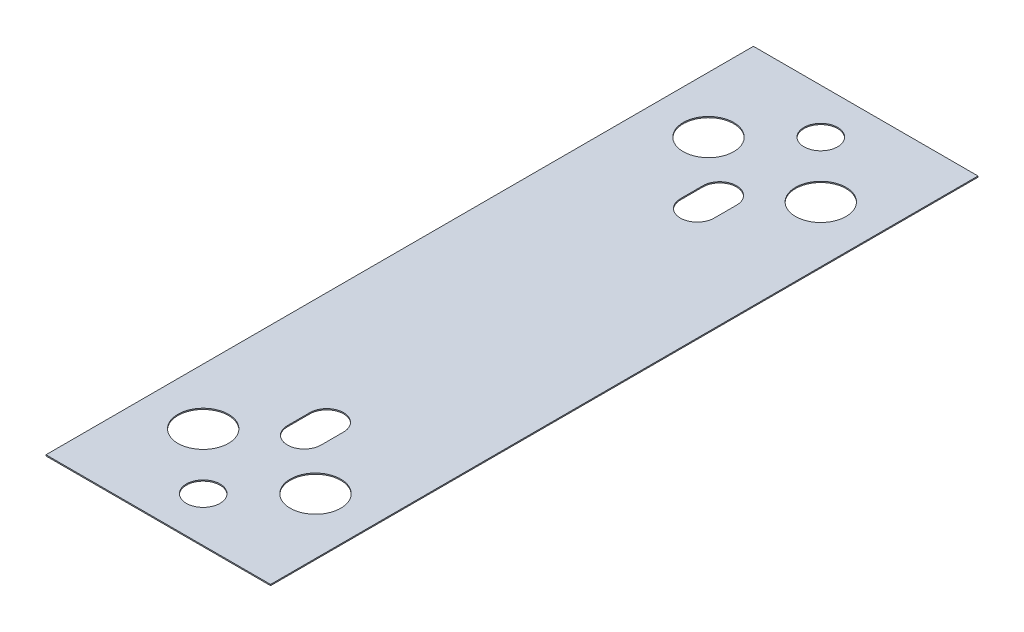
ISO-10303-21;
HEADER;
FILE_DESCRIPTION(('STEP AP214'),'2;1');
FILE_NAME('part.step','',(''),(''),'','','');
FILE_SCHEMA(('AUTOMOTIVE_DESIGN { 1 0 10303 214 1 1 1 1 }'));
ENDSEC;
DATA;
#1=APPLICATION_CONTEXT('core data for automotive mechanical design processes');
#2=APPLICATION_PROTOCOL_DEFINITION('international standard','automotive_design',2000,#1);
#3=PRODUCT_CONTEXT('',#1,'mechanical');
#4=PRODUCT('Part','Part','',(#3));
#5=PRODUCT_RELATED_PRODUCT_CATEGORY('part','',(#4));
#6=PRODUCT_DEFINITION_FORMATION('','',#4);
#7=PRODUCT_DEFINITION_CONTEXT('part definition',#1,'design');
#8=PRODUCT_DEFINITION('design','',#6,#7);
#9=PRODUCT_DEFINITION_SHAPE('','',#8);
#10=(LENGTH_UNIT() NAMED_UNIT(*) SI_UNIT(.MILLI.,.METRE.));
#11=(NAMED_UNIT(*) PLANE_ANGLE_UNIT() SI_UNIT($,.RADIAN.));
#12=(NAMED_UNIT(*) SI_UNIT($,.STERADIAN.) SOLID_ANGLE_UNIT());
#13=UNCERTAINTY_MEASURE_WITH_UNIT(LENGTH_MEASURE(1.E-05),#10,'distance_accuracy_value','');
#14=(GEOMETRIC_REPRESENTATION_CONTEXT(3) GLOBAL_UNCERTAINTY_ASSIGNED_CONTEXT((#13)) GLOBAL_UNIT_ASSIGNED_CONTEXT((#10,
#11,#12)) REPRESENTATION_CONTEXT('',''));
#15=CARTESIAN_POINT('',(0.,0.,0.));
#16=DIRECTION('',(0.,0.,1.));
#17=DIRECTION('',(1.,0.,0.));
#18=AXIS2_PLACEMENT_3D('',#15,#16,#17);
#19=CARTESIAN_POINT('',(0.,0.,31.5));
#20=DIRECTION('',(0.,1.,0.));
#21=DIRECTION('',(0.,0.,1.));
#22=AXIS2_PLACEMENT_3D('',#19,#20,#21);
#23=PLANE('',#22);
#24=DIRECTION('',(1.,0.,0.));
#25=VECTOR('',#24,1.);
#26=CARTESIAN_POINT('',(0.,0.,-31.5));
#27=LINE('',#26,#25);
#28=CARTESIAN_POINT('',(0.,0.,-31.5));
#29=VERTEX_POINT('',#28);
#30=CARTESIAN_POINT('',(20.,0.,-31.5));
#31=VERTEX_POINT('',#30);
#32=EDGE_CURVE('E223',#29,#31,#27,.T.);
#33=ORIENTED_EDGE('',*,*,#32,.T.);
#34=DIRECTION('',(0.,0.,-1.));
#35=VECTOR('',#34,1.);
#36=CARTESIAN_POINT('',(20.,0.,31.5));
#37=LINE('',#36,#35);
#38=CARTESIAN_POINT('',(20.,0.,31.5));
#39=VERTEX_POINT('',#38);
#40=EDGE_CURVE('E25',#39,#31,#37,.T.);
#41=ORIENTED_EDGE('',*,*,#40,.F.);
#42=DIRECTION('',(1.,0.,0.));
#43=VECTOR('',#42,1.);
#44=CARTESIAN_POINT('',(0.,0.,31.5));
#45=LINE('',#44,#43);
#46=CARTESIAN_POINT('',(0.,0.,31.5));
#47=VERTEX_POINT('',#46);
#48=EDGE_CURVE('E213',#47,#39,#45,.T.);
#49=ORIENTED_EDGE('',*,*,#48,.F.);
#50=DIRECTION('',(0.,0.,-1.));
#51=VECTOR('',#50,1.);
#52=CARTESIAN_POINT('',(0.,0.,31.5));
#53=LINE('',#52,#51);
#54=EDGE_CURVE('E11',#47,#29,#53,.T.);
#55=ORIENTED_EDGE('',*,*,#54,.T.);
#56=EDGE_LOOP('',(#33,#41,#49,#55));
#57=FACE_BOUND('',#56,.T.);
#58=CARTESIAN_POINT('',(15.,0.,22.5));
#59=DIRECTION('',(0.,1.,0.));
#60=DIRECTION('',(0.,0.,1.));
#61=AXIS2_PLACEMENT_3D('',#58,#59,#60);
#62=CIRCLE('',#61,2.25);
#63=CARTESIAN_POINT('',(15.,0.,24.75));
#64=VERTEX_POINT('',#63);
#65=EDGE_CURVE('E206',#64,#64,#62,.T.);
#66=ORIENTED_EDGE('',*,*,#65,.T.);
#67=EDGE_LOOP('',(#66));
#68=FACE_BOUND('',#67,.T.);
#69=CARTESIAN_POINT('',(5.,0.,22.5));
#70=DIRECTION('',(0.,1.,0.));
#71=DIRECTION('',(0.,0.,1.));
#72=AXIS2_PLACEMENT_3D('',#69,#70,#71);
#73=CIRCLE('',#72,2.25);
#74=CARTESIAN_POINT('',(5.,0.,24.75));
#75=VERTEX_POINT('',#74);
#76=EDGE_CURVE('E200',#75,#75,#73,.T.);
#77=ORIENTED_EDGE('',*,*,#76,.T.);
#78=EDGE_LOOP('',(#77));
#79=FACE_BOUND('',#78,.T.);
#80=CARTESIAN_POINT('',(10.,0.,27.5));
#81=DIRECTION('',(0.,-1.,0.));
#82=DIRECTION('',(0.,0.,-1.));
#83=AXIS2_PLACEMENT_3D('',#80,#81,#82);
#84=CIRCLE('',#83,1.5);
#85=CARTESIAN_POINT('',(10.,0.,26.));
#86=VERTEX_POINT('',#85);
#87=EDGE_CURVE('E191',#86,#86,#84,.T.);
#88=ORIENTED_EDGE('',*,*,#87,.F.);
#89=EDGE_LOOP('',(#88));
#90=FACE_BOUND('',#89,.T.);
#91=CARTESIAN_POINT('',(10.,0.,18.5));
#92=DIRECTION('',(0.,-1.,0.));
#93=DIRECTION('',(0.,0.,-1.));
#94=AXIS2_PLACEMENT_3D('',#91,#92,#93);
#95=CIRCLE('',#94,1.5);
#96=CARTESIAN_POINT('',(11.5,0.,18.5));
#97=VERTEX_POINT('',#96);
#98=CARTESIAN_POINT('',(8.5,0.,18.5));
#99=VERTEX_POINT('',#98);
#100=EDGE_CURVE('E168',#97,#99,#95,.T.);
#101=ORIENTED_EDGE('',*,*,#100,.F.);
#102=DIRECTION('',(0.,0.,-1.));
#103=VECTOR('',#102,1.);
#104=CARTESIAN_POINT('',(11.5,0.,18.5));
#105=LINE('',#104,#103);
#106=CARTESIAN_POINT('',(11.5,0.,16.5));
#107=VERTEX_POINT('',#106);
#108=EDGE_CURVE('E162',#97,#107,#105,.T.);
#109=ORIENTED_EDGE('',*,*,#108,.T.);
#110=CARTESIAN_POINT('',(10.,0.,16.5));
#111=DIRECTION('',(0.,-1.,0.));
#112=DIRECTION('',(0.,0.,-1.));
#113=AXIS2_PLACEMENT_3D('',#110,#111,#112);
#114=CIRCLE('',#113,1.5);
#115=CARTESIAN_POINT('',(8.5,0.,16.5));
#116=VERTEX_POINT('',#115);
#117=EDGE_CURVE('E176',#116,#107,#114,.T.);
#118=ORIENTED_EDGE('',*,*,#117,.F.);
#119=DIRECTION('',(0.,0.,-1.));
#120=VECTOR('',#119,1.);
#121=CARTESIAN_POINT('',(8.5,0.,18.5));
#122=LINE('',#121,#120);
#123=EDGE_CURVE('E160',#99,#116,#122,.T.);
#124=ORIENTED_EDGE('',*,*,#123,.F.);
#125=EDGE_LOOP('',(#101,#109,#118,#124));
#126=FACE_BOUND('',#125,.T.);
#127=CARTESIAN_POINT('',(15.,0.,-22.5));
#128=DIRECTION('',(0.,1.,0.));
#129=DIRECTION('',(0.,0.,1.));
#130=AXIS2_PLACEMENT_3D('',#127,#128,#129);
#131=CIRCLE('',#130,2.25);
#132=CARTESIAN_POINT('',(15.,0.,-20.25));
#133=VERTEX_POINT('',#132);
#134=EDGE_CURVE('E157',#133,#133,#131,.T.);
#135=ORIENTED_EDGE('',*,*,#134,.T.);
#136=EDGE_LOOP('',(#135));
#137=FACE_BOUND('',#136,.T.);
#138=CARTESIAN_POINT('',(5.,0.,-22.5));
#139=DIRECTION('',(0.,1.,0.));
#140=DIRECTION('',(0.,0.,1.));
#141=AXIS2_PLACEMENT_3D('',#138,#139,#140);
#142=CIRCLE('',#141,2.25);
#143=CARTESIAN_POINT('',(5.,0.,-20.25));
#144=VERTEX_POINT('',#143);
#145=EDGE_CURVE('E151',#144,#144,#142,.T.);
#146=ORIENTED_EDGE('',*,*,#145,.T.);
#147=EDGE_LOOP('',(#146));
#148=FACE_BOUND('',#147,.T.);
#149=CARTESIAN_POINT('',(10.,0.,-27.5));
#150=DIRECTION('',(0.,-1.,0.));
#151=DIRECTION('',(0.,0.,-1.));
#152=AXIS2_PLACEMENT_3D('',#149,#150,#151);
#153=CIRCLE('',#152,1.5);
#154=CARTESIAN_POINT('',(10.,0.,-29.));
#155=VERTEX_POINT('',#154);
#156=EDGE_CURVE('E142',#155,#155,#153,.T.);
#157=ORIENTED_EDGE('',*,*,#156,.F.);
#158=EDGE_LOOP('',(#157));
#159=FACE_BOUND('',#158,.T.);
#160=CARTESIAN_POINT('',(10.,0.,-16.5));
#161=DIRECTION('',(0.,-1.,0.));
#162=DIRECTION('',(0.,0.,-1.));
#163=AXIS2_PLACEMENT_3D('',#160,#161,#162);
#164=CIRCLE('',#163,1.5);
#165=CARTESIAN_POINT('',(11.5,0.,-16.5));
#166=VERTEX_POINT('',#165);
#167=CARTESIAN_POINT('',(8.5,0.,-16.5));
#168=VERTEX_POINT('',#167);
#169=EDGE_CURVE('E116',#166,#168,#164,.T.);
#170=ORIENTED_EDGE('',*,*,#169,.F.);
#171=DIRECTION('',(0.,0.,1.));
#172=VECTOR('',#171,1.);
#173=CARTESIAN_POINT('',(11.5,0.,-18.5));
#174=LINE('',#173,#172);
#175=CARTESIAN_POINT('',(11.5,0.,-18.5));
#176=VERTEX_POINT('',#175);
#177=EDGE_CURVE('E125',#176,#166,#174,.T.);
#178=ORIENTED_EDGE('',*,*,#177,.F.);
#179=CARTESIAN_POINT('',(10.,0.,-18.5));
#180=DIRECTION('',(0.,-1.,0.));
#181=DIRECTION('',(0.,0.,-1.));
#182=AXIS2_PLACEMENT_3D('',#179,#180,#181);
#183=CIRCLE('',#182,1.5);
#184=CARTESIAN_POINT('',(8.5,0.,-18.5));
#185=VERTEX_POINT('',#184);
#186=EDGE_CURVE('E123',#185,#176,#183,.T.);
#187=ORIENTED_EDGE('',*,*,#186,.F.);
#188=DIRECTION('',(0.,0.,1.));
#189=VECTOR('',#188,1.);
#190=CARTESIAN_POINT('',(8.5,0.,-18.5));
#191=LINE('',#190,#189);
#192=EDGE_CURVE('E109',#185,#168,#191,.T.);
#193=ORIENTED_EDGE('',*,*,#192,.T.);
#194=EDGE_LOOP('',(#170,#178,#187,#193));
#195=FACE_BOUND('',#194,.T.);
#196=ADVANCED_FACE('F17',(#57,#68,#79,#90,#126,#137,#148,#159,#195),#23,.F.);
#197=CARTESIAN_POINT('',(0.,0.1,31.5));
#198=DIRECTION('',(0.,-1.,0.));
#199=DIRECTION('',(0.,0.,-1.));
#200=AXIS2_PLACEMENT_3D('',#197,#198,#199);
#201=PLANE('',#200);
#202=CARTESIAN_POINT('',(10.,0.1,-16.5));
#203=DIRECTION('',(0.,-1.,0.));
#204=DIRECTION('',(0.,0.,-1.));
#205=AXIS2_PLACEMENT_3D('',#202,#203,#204);
#206=CIRCLE('',#205,1.49999999999999);
#207=CARTESIAN_POINT('',(11.5,0.1,-16.5));
#208=VERTEX_POINT('',#207);
#209=CARTESIAN_POINT('',(8.5,0.1,-16.5));
#210=VERTEX_POINT('',#209);
#211=EDGE_CURVE('E140',#208,#210,#206,.T.);
#212=ORIENTED_EDGE('',*,*,#211,.T.);
#213=DIRECTION('',(0.,0.,-1.));
#214=VECTOR('',#213,1.);
#215=CARTESIAN_POINT('',(8.5,0.1,31.5));
#216=LINE('',#215,#214);
#217=CARTESIAN_POINT('',(8.5,0.1,-18.5));
#218=VERTEX_POINT('',#217);
#219=EDGE_CURVE('E112',#210,#218,#216,.T.);
#220=ORIENTED_EDGE('',*,*,#219,.T.);
#221=CARTESIAN_POINT('',(10.,0.1,-18.5));
#222=DIRECTION('',(0.,-1.,0.));
#223=DIRECTION('',(0.,0.,-1.));
#224=AXIS2_PLACEMENT_3D('',#221,#222,#223);
#225=CIRCLE('',#224,1.49999999999999);
#226=CARTESIAN_POINT('',(11.5,0.1,-18.5));
#227=VERTEX_POINT('',#226);
#228=EDGE_CURVE('E137',#218,#227,#225,.T.);
#229=ORIENTED_EDGE('',*,*,#228,.T.);
#230=DIRECTION('',(0.,0.,1.));
#231=VECTOR('',#230,1.);
#232=CARTESIAN_POINT('',(11.5,0.1,31.5));
#233=LINE('',#232,#231);
#234=EDGE_CURVE('E115',#227,#208,#233,.T.);
#235=ORIENTED_EDGE('',*,*,#234,.T.);
#236=EDGE_LOOP('',(#212,#220,#229,#235));
#237=FACE_BOUND('',#236,.T.);
#238=CARTESIAN_POINT('',(10.,0.1,-27.5));
#239=DIRECTION('',(0.,-1.,0.));
#240=DIRECTION('',(0.,0.,-1.));
#241=AXIS2_PLACEMENT_3D('',#238,#239,#240);
#242=CIRCLE('',#241,1.5);
#243=CARTESIAN_POINT('',(10.,0.1,-29.));
#244=VERTEX_POINT('',#243);
#245=EDGE_CURVE('E145',#244,#244,#242,.T.);
#246=ORIENTED_EDGE('',*,*,#245,.T.);
#247=EDGE_LOOP('',(#246));
#248=FACE_BOUND('',#247,.T.);
#249=CARTESIAN_POINT('',(5.,0.100000000000001,-22.5));
#250=DIRECTION('',(0.,1.,0.));
#251=DIRECTION('',(0.,0.,1.));
#252=AXIS2_PLACEMENT_3D('',#249,#250,#251);
#253=CIRCLE('',#252,2.25);
#254=CARTESIAN_POINT('',(5.,0.100000000000001,-20.25));
#255=VERTEX_POINT('',#254);
#256=EDGE_CURVE('E148',#255,#255,#253,.T.);
#257=ORIENTED_EDGE('',*,*,#256,.F.);
#258=EDGE_LOOP('',(#257));
#259=FACE_BOUND('',#258,.T.);
#260=CARTESIAN_POINT('',(15.,0.100000000000001,-22.5));
#261=DIRECTION('',(0.,1.,0.));
#262=DIRECTION('',(0.,0.,1.));
#263=AXIS2_PLACEMENT_3D('',#260,#261,#262);
#264=CIRCLE('',#263,2.25);
#265=CARTESIAN_POINT('',(15.,0.100000000000001,-20.25));
#266=VERTEX_POINT('',#265);
#267=EDGE_CURVE('E154',#266,#266,#264,.T.);
#268=ORIENTED_EDGE('',*,*,#267,.F.);
#269=EDGE_LOOP('',(#268));
#270=FACE_BOUND('',#269,.T.);
#271=CARTESIAN_POINT('',(5.,0.100000000000001,22.5));
#272=DIRECTION('',(0.,1.,0.));
#273=DIRECTION('',(0.,0.,1.));
#274=AXIS2_PLACEMENT_3D('',#271,#272,#273);
#275=CIRCLE('',#274,2.25);
#276=CARTESIAN_POINT('',(5.,0.100000000000001,24.75));
#277=VERTEX_POINT('',#276);
#278=EDGE_CURVE('E197',#277,#277,#275,.T.);
#279=ORIENTED_EDGE('',*,*,#278,.F.);
#280=EDGE_LOOP('',(#279));
#281=FACE_BOUND('',#280,.T.);
#282=DIRECTION('',(-1.,0.,0.));
#283=VECTOR('',#282,1.);
#284=CARTESIAN_POINT('',(0.,0.1,-31.5));
#285=LINE('',#284,#283);
#286=CARTESIAN_POINT('',(20.,0.1,-31.5));
#287=VERTEX_POINT('',#286);
#288=CARTESIAN_POINT('',(0.,0.1,-31.5));
#289=VERTEX_POINT('',#288);
#290=EDGE_CURVE('E214',#287,#289,#285,.T.);
#291=ORIENTED_EDGE('',*,*,#290,.T.);
#292=DIRECTION('',(0.,0.,-1.));
#293=VECTOR('',#292,1.);
#294=CARTESIAN_POINT('',(0.,0.1,31.5));
#295=LINE('',#294,#293);
#296=CARTESIAN_POINT('',(0.,0.1,31.5));
#297=VERTEX_POINT('',#296);
#298=EDGE_CURVE('E220',#297,#289,#295,.T.);
#299=ORIENTED_EDGE('',*,*,#298,.F.);
#300=DIRECTION('',(-1.,0.,0.));
#301=VECTOR('',#300,1.);
#302=CARTESIAN_POINT('',(0.,0.1,31.5));
#303=LINE('',#302,#301);
#304=CARTESIAN_POINT('',(20.,0.1,31.5));
#305=VERTEX_POINT('',#304);
#306=EDGE_CURVE('E218',#305,#297,#303,.T.);
#307=ORIENTED_EDGE('',*,*,#306,.F.);
#308=DIRECTION('',(0.,0.,-1.));
#309=VECTOR('',#308,1.);
#310=CARTESIAN_POINT('',(20.,0.1,31.5));
#311=LINE('',#310,#309);
#312=EDGE_CURVE('E230',#305,#287,#311,.T.);
#313=ORIENTED_EDGE('',*,*,#312,.T.);
#314=EDGE_LOOP('',(#291,#299,#307,#313));
#315=FACE_BOUND('',#314,.T.);
#316=CARTESIAN_POINT('',(15.,0.100000000000001,22.5));
#317=DIRECTION('',(0.,1.,0.));
#318=DIRECTION('',(0.,0.,1.));
#319=AXIS2_PLACEMENT_3D('',#316,#317,#318);
#320=CIRCLE('',#319,2.25);
#321=CARTESIAN_POINT('',(15.,0.100000000000001,24.75));
#322=VERTEX_POINT('',#321);
#323=EDGE_CURVE('E203',#322,#322,#320,.T.);
#324=ORIENTED_EDGE('',*,*,#323,.F.);
#325=EDGE_LOOP('',(#324));
#326=FACE_BOUND('',#325,.T.);
#327=CARTESIAN_POINT('',(10.,0.1,27.5));
#328=DIRECTION('',(0.,-1.,0.));
#329=DIRECTION('',(0.,0.,-1.));
#330=AXIS2_PLACEMENT_3D('',#327,#328,#329);
#331=CIRCLE('',#330,1.5);
#332=CARTESIAN_POINT('',(10.,0.1,26.));
#333=VERTEX_POINT('',#332);
#334=EDGE_CURVE('E194',#333,#333,#331,.T.);
#335=ORIENTED_EDGE('',*,*,#334,.T.);
#336=EDGE_LOOP('',(#335));
#337=FACE_BOUND('',#336,.T.);
#338=DIRECTION('',(0.,0.,-1.));
#339=VECTOR('',#338,1.);
#340=CARTESIAN_POINT('',(11.5,0.1,31.5));
#341=LINE('',#340,#339);
#342=CARTESIAN_POINT('',(11.5,0.1,18.5));
#343=VERTEX_POINT('',#342);
#344=CARTESIAN_POINT('',(11.5,0.1,16.5));
#345=VERTEX_POINT('',#344);
#346=EDGE_CURVE('E183',#343,#345,#341,.T.);
#347=ORIENTED_EDGE('',*,*,#346,.F.);
#348=CARTESIAN_POINT('',(10.,0.1,18.5));
#349=DIRECTION('',(0.,-1.,0.));
#350=DIRECTION('',(0.,0.,-1.));
#351=AXIS2_PLACEMENT_3D('',#348,#349,#350);
#352=CIRCLE('',#351,1.49999999999999);
#353=CARTESIAN_POINT('',(8.5,0.1,18.5));
#354=VERTEX_POINT('',#353);
#355=EDGE_CURVE('E188',#343,#354,#352,.T.);
#356=ORIENTED_EDGE('',*,*,#355,.T.);
#357=DIRECTION('',(0.,0.,-1.));
#358=VECTOR('',#357,1.);
#359=CARTESIAN_POINT('',(8.5,0.1,31.5));
#360=LINE('',#359,#358);
#361=CARTESIAN_POINT('',(8.5,0.1,16.5));
#362=VERTEX_POINT('',#361);
#363=EDGE_CURVE('E180',#354,#362,#360,.T.);
#364=ORIENTED_EDGE('',*,*,#363,.T.);
#365=CARTESIAN_POINT('',(10.,0.1,16.5));
#366=DIRECTION('',(0.,-1.,0.));
#367=DIRECTION('',(0.,0.,-1.));
#368=AXIS2_PLACEMENT_3D('',#365,#366,#367);
#369=CIRCLE('',#368,1.49999999999999);
#370=EDGE_CURVE('E185',#362,#345,#369,.T.);
#371=ORIENTED_EDGE('',*,*,#370,.T.);
#372=EDGE_LOOP('',(#347,#356,#364,#371));
#373=FACE_BOUND('',#372,.T.);
#374=ADVANCED_FACE('F246',(#237,#248,#259,#270,#281,#315,#326,#337,#373),#201,.F.);
#375=CARTESIAN_POINT('',(0.,0.,31.5));
#376=DIRECTION('',(1.,0.,0.));
#377=DIRECTION('',(0.,0.,-1.));
#378=AXIS2_PLACEMENT_3D('',#375,#376,#377);
#379=PLANE('',#378);
#380=DIRECTION('',(0.,-1.,0.));
#381=VECTOR('',#380,1.);
#382=CARTESIAN_POINT('',(0.,0.,-31.5));
#383=LINE('',#382,#381);
#384=EDGE_CURVE('E209',#289,#29,#383,.T.);
#385=ORIENTED_EDGE('',*,*,#384,.T.);
#386=ORIENTED_EDGE('',*,*,#54,.F.);
#387=DIRECTION('',(0.,-1.,0.));
#388=VECTOR('',#387,1.);
#389=CARTESIAN_POINT('',(0.,0.,31.5));
#390=LINE('',#389,#388);
#391=EDGE_CURVE('E210',#297,#47,#390,.T.);
#392=ORIENTED_EDGE('',*,*,#391,.F.);
#393=ORIENTED_EDGE('',*,*,#298,.T.);
#394=EDGE_LOOP('',(#385,#386,#392,#393));
#395=FACE_BOUND('',#394,.T.);
#396=ADVANCED_FACE('F19',(#395),#379,.F.);
#397=CARTESIAN_POINT('',(20.,0.,31.5));
#398=DIRECTION('',(-1.,0.,0.));
#399=DIRECTION('',(0.,0.,1.));
#400=AXIS2_PLACEMENT_3D('',#397,#398,#399);
#401=PLANE('',#400);
#402=DIRECTION('',(0.,1.,0.));
#403=VECTOR('',#402,1.);
#404=CARTESIAN_POINT('',(20.,0.,-31.5));
#405=LINE('',#404,#403);
#406=EDGE_CURVE('E225',#31,#287,#405,.T.);
#407=ORIENTED_EDGE('',*,*,#406,.T.);
#408=ORIENTED_EDGE('',*,*,#312,.F.);
#409=DIRECTION('',(0.,1.,0.));
#410=VECTOR('',#409,1.);
#411=CARTESIAN_POINT('',(20.,0.,31.5));
#412=LINE('',#411,#410);
#413=EDGE_CURVE('E216',#39,#305,#412,.T.);
#414=ORIENTED_EDGE('',*,*,#413,.F.);
#415=ORIENTED_EDGE('',*,*,#40,.T.);
#416=EDGE_LOOP('',(#407,#408,#414,#415));
#417=FACE_BOUND('',#416,.T.);
#418=ADVANCED_FACE('F237',(#417),#401,.F.);
#419=CARTESIAN_POINT('',(0.,0.,31.5));
#420=DIRECTION('',(0.,0.,-1.));
#421=DIRECTION('',(-1.,0.,0.));
#422=AXIS2_PLACEMENT_3D('',#419,#420,#421);
#423=PLANE('',#422);
#424=ORIENTED_EDGE('',*,*,#391,.T.);
#425=ORIENTED_EDGE('',*,*,#48,.T.);
#426=ORIENTED_EDGE('',*,*,#413,.T.);
#427=ORIENTED_EDGE('',*,*,#306,.T.);
#428=EDGE_LOOP('',(#424,#425,#426,#427));
#429=FACE_BOUND('',#428,.T.);
#430=ADVANCED_FACE('F253',(#429),#423,.F.);
#431=CARTESIAN_POINT('',(0.,0.,-31.5));
#432=DIRECTION('',(0.,0.,-1.));
#433=DIRECTION('',(-1.,0.,0.));
#434=AXIS2_PLACEMENT_3D('',#431,#432,#433);
#435=PLANE('',#434);
#436=ORIENTED_EDGE('',*,*,#384,.F.);
#437=ORIENTED_EDGE('',*,*,#290,.F.);
#438=ORIENTED_EDGE('',*,*,#406,.F.);
#439=ORIENTED_EDGE('',*,*,#32,.F.);
#440=EDGE_LOOP('',(#436,#437,#438,#439));
#441=FACE_BOUND('',#440,.T.);
#442=ADVANCED_FACE('F243',(#441),#435,.T.);
#443=CARTESIAN_POINT('',(15.,0.1,22.5));
#444=DIRECTION('',(0.,1.,0.));
#445=DIRECTION('',(0.,0.,1.));
#446=AXIS2_PLACEMENT_3D('',#443,#444,#445);
#447=CYLINDRICAL_SURFACE('',#446,2.25);
#448=ORIENTED_EDGE('',*,*,#65,.F.);
#449=EDGE_LOOP('',(#448));
#450=FACE_BOUND('',#449,.T.);
#451=ORIENTED_EDGE('',*,*,#323,.T.);
#452=EDGE_LOOP('',(#451));
#453=FACE_BOUND('',#452,.T.);
#454=ADVANCED_FACE('F291',(#450,#453),#447,.F.);
#455=CARTESIAN_POINT('',(5.,0.1,22.5));
#456=DIRECTION('',(0.,1.,0.));
#457=DIRECTION('',(0.,0.,1.));
#458=AXIS2_PLACEMENT_3D('',#455,#456,#457);
#459=CYLINDRICAL_SURFACE('',#458,2.25);
#460=ORIENTED_EDGE('',*,*,#76,.F.);
#461=EDGE_LOOP('',(#460));
#462=FACE_BOUND('',#461,.T.);
#463=ORIENTED_EDGE('',*,*,#278,.T.);
#464=EDGE_LOOP('',(#463));
#465=FACE_BOUND('',#464,.T.);
#466=ADVANCED_FACE('F288',(#462,#465),#459,.F.);
#467=CARTESIAN_POINT('',(10.,0.,27.5));
#468=DIRECTION('',(0.,-1.,0.));
#469=DIRECTION('',(0.,0.,-1.));
#470=AXIS2_PLACEMENT_3D('',#467,#468,#469);
#471=CYLINDRICAL_SURFACE('',#470,1.5);
#472=ORIENTED_EDGE('',*,*,#87,.T.);
#473=EDGE_LOOP('',(#472));
#474=FACE_BOUND('',#473,.T.);
#475=ORIENTED_EDGE('',*,*,#334,.F.);
#476=EDGE_LOOP('',(#475));
#477=FACE_BOUND('',#476,.T.);
#478=ADVANCED_FACE('F290',(#474,#477),#471,.F.);
#479=CARTESIAN_POINT('',(10.,0.,18.5));
#480=DIRECTION('',(0.,-1.,0.));
#481=DIRECTION('',(0.,0.,-1.));
#482=AXIS2_PLACEMENT_3D('',#479,#480,#481);
#483=CYLINDRICAL_SURFACE('',#482,1.49999999999999);
#484=DIRECTION('',(0.,1.,0.));
#485=VECTOR('',#484,1.);
#486=CARTESIAN_POINT('',(11.5,7.,18.5));
#487=LINE('',#486,#485);
#488=EDGE_CURVE('E165',#97,#343,#487,.T.);
#489=ORIENTED_EDGE('',*,*,#488,.F.);
#490=ORIENTED_EDGE('',*,*,#100,.T.);
#491=DIRECTION('',(0.,-1.,0.));
#492=VECTOR('',#491,1.);
#493=CARTESIAN_POINT('',(8.5,0.,18.5));
#494=LINE('',#493,#492);
#495=EDGE_CURVE('E170',#354,#99,#494,.T.);
#496=ORIENTED_EDGE('',*,*,#495,.F.);
#497=ORIENTED_EDGE('',*,*,#355,.F.);
#498=EDGE_LOOP('',(#489,#490,#496,#497));
#499=FACE_BOUND('',#498,.T.);
#500=ADVANCED_FACE('F300',(#499),#483,.F.);
#501=CARTESIAN_POINT('',(10.,0.,16.5));
#502=DIRECTION('',(0.,-1.,0.));
#503=DIRECTION('',(0.,0.,-1.));
#504=AXIS2_PLACEMENT_3D('',#501,#502,#503);
#505=CYLINDRICAL_SURFACE('',#504,1.49999999999999);
#506=DIRECTION('',(0.,-1.,0.));
#507=VECTOR('',#506,1.);
#508=CARTESIAN_POINT('',(8.5,0.,16.5));
#509=LINE('',#508,#507);
#510=EDGE_CURVE('E178',#116,#362,#509,.F.);
#511=ORIENTED_EDGE('',*,*,#510,.F.);
#512=ORIENTED_EDGE('',*,*,#117,.T.);
#513=DIRECTION('',(0.,1.,0.));
#514=VECTOR('',#513,1.);
#515=CARTESIAN_POINT('',(11.5,7.,16.5));
#516=LINE('',#515,#514);
#517=EDGE_CURVE('E173',#107,#345,#516,.T.);
#518=ORIENTED_EDGE('',*,*,#517,.T.);
#519=ORIENTED_EDGE('',*,*,#370,.F.);
#520=EDGE_LOOP('',(#511,#512,#518,#519));
#521=FACE_BOUND('',#520,.T.);
#522=ADVANCED_FACE('F400',(#521),#505,.F.);
#523=CARTESIAN_POINT('',(11.5,7.,18.5));
#524=DIRECTION('',(-1.,0.,0.));
#525=DIRECTION('',(0.,-1.,0.));
#526=AXIS2_PLACEMENT_3D('',#523,#524,#525);
#527=PLANE('',#526);
#528=ORIENTED_EDGE('',*,*,#346,.T.);
#529=ORIENTED_EDGE('',*,*,#517,.F.);
#530=ORIENTED_EDGE('',*,*,#108,.F.);
#531=ORIENTED_EDGE('',*,*,#488,.T.);
#532=EDGE_LOOP('',(#528,#529,#530,#531));
#533=FACE_BOUND('',#532,.T.);
#534=ADVANCED_FACE('F396',(#533),#527,.T.);
#535=CARTESIAN_POINT('',(8.5,0.,18.5));
#536=DIRECTION('',(-1.,0.,0.));
#537=DIRECTION('',(0.,0.,1.));
#538=AXIS2_PLACEMENT_3D('',#535,#536,#537);
#539=PLANE('',#538);
#540=ORIENTED_EDGE('',*,*,#495,.T.);
#541=ORIENTED_EDGE('',*,*,#123,.T.);
#542=ORIENTED_EDGE('',*,*,#510,.T.);
#543=ORIENTED_EDGE('',*,*,#363,.F.);
#544=EDGE_LOOP('',(#540,#541,#542,#543));
#545=FACE_BOUND('',#544,.T.);
#546=ADVANCED_FACE('F392',(#545),#539,.F.);
#547=CARTESIAN_POINT('',(15.,0.1,-22.5));
#548=DIRECTION('',(0.,1.,0.));
#549=DIRECTION('',(0.,0.,1.));
#550=AXIS2_PLACEMENT_3D('',#547,#548,#549);
#551=CYLINDRICAL_SURFACE('',#550,2.25);
#552=ORIENTED_EDGE('',*,*,#134,.F.);
#553=EDGE_LOOP('',(#552));
#554=FACE_BOUND('',#553,.T.);
#555=ORIENTED_EDGE('',*,*,#267,.T.);
#556=EDGE_LOOP('',(#555));
#557=FACE_BOUND('',#556,.T.);
#558=ADVANCED_FACE('F389',(#554,#557),#551,.F.);
#559=CARTESIAN_POINT('',(5.,0.1,-22.5));
#560=DIRECTION('',(0.,1.,0.));
#561=DIRECTION('',(0.,0.,1.));
#562=AXIS2_PLACEMENT_3D('',#559,#560,#561);
#563=CYLINDRICAL_SURFACE('',#562,2.25);
#564=ORIENTED_EDGE('',*,*,#145,.F.);
#565=EDGE_LOOP('',(#564));
#566=FACE_BOUND('',#565,.T.);
#567=ORIENTED_EDGE('',*,*,#256,.T.);
#568=EDGE_LOOP('',(#567));
#569=FACE_BOUND('',#568,.T.);
#570=ADVANCED_FACE('F274',(#566,#569),#563,.F.);
#571=CARTESIAN_POINT('',(10.,0.,-27.5));
#572=DIRECTION('',(0.,-1.,0.));
#573=DIRECTION('',(0.,0.,-1.));
#574=AXIS2_PLACEMENT_3D('',#571,#572,#573);
#575=CYLINDRICAL_SURFACE('',#574,1.5);
#576=ORIENTED_EDGE('',*,*,#156,.T.);
#577=EDGE_LOOP('',(#576));
#578=FACE_BOUND('',#577,.T.);
#579=ORIENTED_EDGE('',*,*,#245,.F.);
#580=EDGE_LOOP('',(#579));
#581=FACE_BOUND('',#580,.T.);
#582=ADVANCED_FACE('F271',(#578,#581),#575,.F.);
#583=CARTESIAN_POINT('',(10.,0.,-16.5));
#584=DIRECTION('',(0.,-1.,0.));
#585=DIRECTION('',(0.,0.,-1.));
#586=AXIS2_PLACEMENT_3D('',#583,#584,#585);
#587=CYLINDRICAL_SURFACE('',#586,1.49999999999999);
#588=DIRECTION('',(0.,1.,0.));
#589=VECTOR('',#588,1.);
#590=CARTESIAN_POINT('',(11.5,7.,-16.5));
#591=LINE('',#590,#589);
#592=EDGE_CURVE('E32',#166,#208,#591,.T.);
#593=ORIENTED_EDGE('',*,*,#592,.F.);
#594=ORIENTED_EDGE('',*,*,#169,.T.);
#595=DIRECTION('',(0.,-1.,0.));
#596=VECTOR('',#595,1.);
#597=CARTESIAN_POINT('',(8.5,0.,-16.5));
#598=LINE('',#597,#596);
#599=EDGE_CURVE('E105',#210,#168,#598,.T.);
#600=ORIENTED_EDGE('',*,*,#599,.F.);
#601=ORIENTED_EDGE('',*,*,#211,.F.);
#602=EDGE_LOOP('',(#593,#594,#600,#601));
#603=FACE_BOUND('',#602,.T.);
#604=ADVANCED_FACE('F119',(#603),#587,.F.);
#605=CARTESIAN_POINT('',(10.,0.,-18.5));
#606=DIRECTION('',(0.,-1.,0.));
#607=DIRECTION('',(0.,0.,-1.));
#608=AXIS2_PLACEMENT_3D('',#605,#606,#607);
#609=CYLINDRICAL_SURFACE('',#608,1.49999999999999);
#610=DIRECTION('',(0.,-1.,0.));
#611=VECTOR('',#610,1.);
#612=CARTESIAN_POINT('',(8.5,0.,-18.5));
#613=LINE('',#612,#611);
#614=EDGE_CURVE('E40',#185,#218,#613,.F.);
#615=ORIENTED_EDGE('',*,*,#614,.F.);
#616=ORIENTED_EDGE('',*,*,#186,.T.);
#617=DIRECTION('',(0.,1.,0.));
#618=VECTOR('',#617,1.);
#619=CARTESIAN_POINT('',(11.5,7.,-18.5));
#620=LINE('',#619,#618);
#621=EDGE_CURVE('E124',#176,#227,#620,.T.);
#622=ORIENTED_EDGE('',*,*,#621,.T.);
#623=ORIENTED_EDGE('',*,*,#228,.F.);
#624=EDGE_LOOP('',(#615,#616,#622,#623));
#625=FACE_BOUND('',#624,.T.);
#626=ADVANCED_FACE('F357',(#625),#609,.F.);
#627=CARTESIAN_POINT('',(8.5,0.,-18.5));
#628=DIRECTION('',(-1.,0.,0.));
#629=DIRECTION('',(0.,0.,1.));
#630=AXIS2_PLACEMENT_3D('',#627,#628,#629);
#631=PLANE('',#630);
#632=ORIENTED_EDGE('',*,*,#599,.T.);
#633=ORIENTED_EDGE('',*,*,#192,.F.);
#634=ORIENTED_EDGE('',*,*,#614,.T.);
#635=ORIENTED_EDGE('',*,*,#219,.F.);
#636=EDGE_LOOP('',(#632,#633,#634,#635));
#637=FACE_BOUND('',#636,.T.);
#638=ADVANCED_FACE('F107',(#637),#631,.F.);
#639=CARTESIAN_POINT('',(11.5,7.,-18.5));
#640=DIRECTION('',(1.,0.,0.));
#641=DIRECTION('',(0.,1.,0.));
#642=AXIS2_PLACEMENT_3D('',#639,#640,#641);
#643=PLANE('',#642);
#644=ORIENTED_EDGE('',*,*,#621,.F.);
#645=ORIENTED_EDGE('',*,*,#177,.T.);
#646=ORIENTED_EDGE('',*,*,#592,.T.);
#647=ORIENTED_EDGE('',*,*,#234,.F.);
#648=EDGE_LOOP('',(#644,#645,#646,#647));
#649=FACE_BOUND('',#648,.T.);
#650=ADVANCED_FACE('F371',(#649),#643,.F.);
#651=CLOSED_SHELL('',(#196,#374,#396,#418,#430,#442,#454,#466,#478,#500,#522,#534,#546,#558,
#570,#582,#604,#626,#638,#650));
#652=MANIFOLD_SOLID_BREP('B1',#651);
#653=ADVANCED_BREP_SHAPE_REPRESENTATION('',(#18,#652),#14);
#654=SHAPE_DEFINITION_REPRESENTATION(#9,#653);
ENDSEC;
END-ISO-10303-21;
